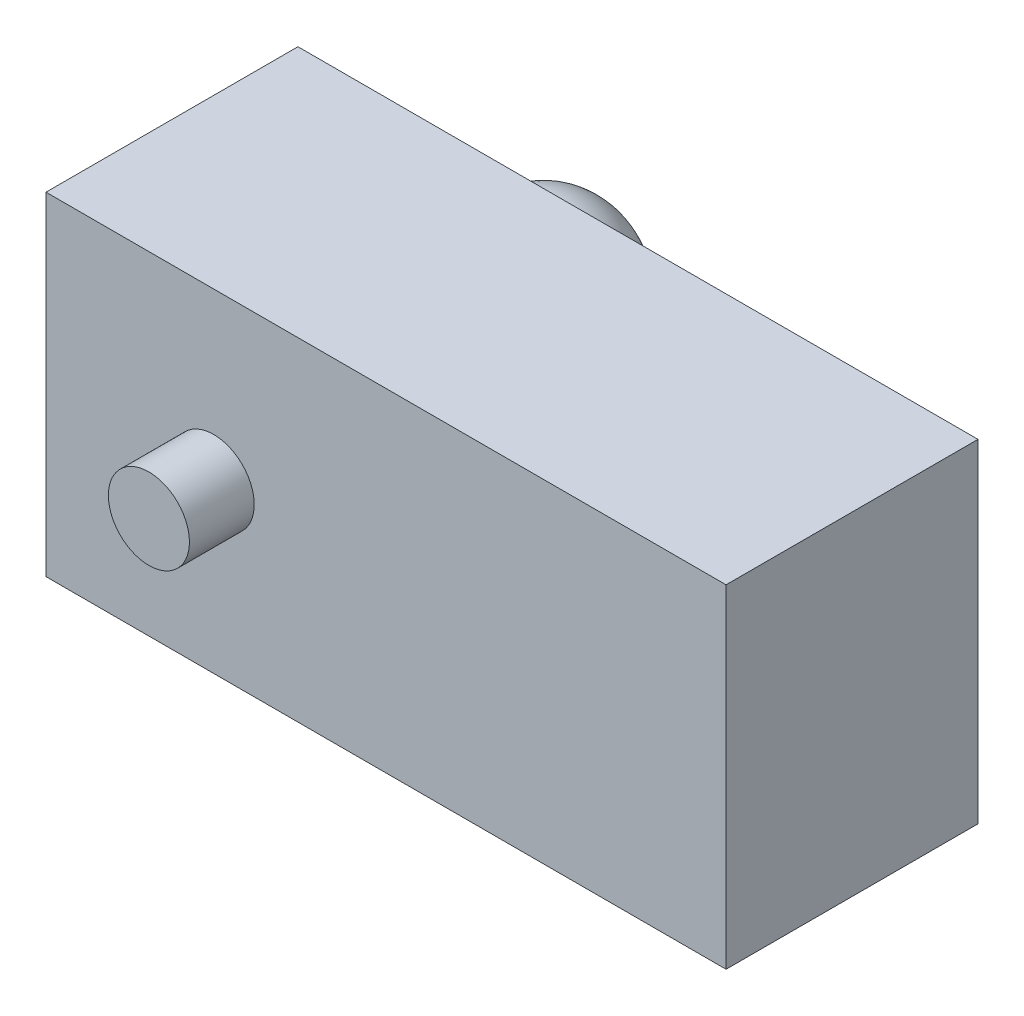
ISO-10303-21;
HEADER;
FILE_DESCRIPTION(('STEP AP214'),'2;1');
FILE_NAME('part.step','',(''),(''),'','','');
FILE_SCHEMA(('AUTOMOTIVE_DESIGN { 1 0 10303 214 1 1 1 1 }'));
ENDSEC;
DATA;
#1=APPLICATION_CONTEXT('core data for automotive mechanical design processes');
#2=APPLICATION_PROTOCOL_DEFINITION('international standard','automotive_design',2000,#1);
#3=PRODUCT_CONTEXT('',#1,'mechanical');
#4=PRODUCT('Part','Part','',(#3));
#5=PRODUCT_RELATED_PRODUCT_CATEGORY('part','',(#4));
#6=PRODUCT_DEFINITION_FORMATION('','',#4);
#7=PRODUCT_DEFINITION_CONTEXT('part definition',#1,'design');
#8=PRODUCT_DEFINITION('design','',#6,#7);
#9=PRODUCT_DEFINITION_SHAPE('','',#8);
#10=(LENGTH_UNIT() NAMED_UNIT(*) SI_UNIT(.MILLI.,.METRE.));
#11=(NAMED_UNIT(*) PLANE_ANGLE_UNIT() SI_UNIT($,.RADIAN.));
#12=(NAMED_UNIT(*) SI_UNIT($,.STERADIAN.) SOLID_ANGLE_UNIT());
#13=UNCERTAINTY_MEASURE_WITH_UNIT(LENGTH_MEASURE(1.E-05),#10,'distance_accuracy_value','');
#14=(GEOMETRIC_REPRESENTATION_CONTEXT(3) GLOBAL_UNCERTAINTY_ASSIGNED_CONTEXT((#13)) GLOBAL_UNIT_ASSIGNED_CONTEXT((#10,
#11,#12)) REPRESENTATION_CONTEXT('',''));
#15=CARTESIAN_POINT('',(0.,0.,0.));
#16=DIRECTION('',(0.,0.,1.));
#17=DIRECTION('',(1.,0.,0.));
#18=AXIS2_PLACEMENT_3D('',#15,#16,#17);
#19=CARTESIAN_POINT('',(-4.89,0.,-4.3));
#20=DIRECTION('',(0.,0.,-1.));
#21=DIRECTION('',(-1.,0.,0.));
#22=AXIS2_PLACEMENT_3D('',#19,#20,#21);
#23=PLANE('',#22);
#24=CARTESIAN_POINT('',(-4.89,0.,-4.3));
#25=DIRECTION('',(0.,0.,1.));
#26=DIRECTION('',(1.,0.,0.));
#27=AXIS2_PLACEMENT_3D('',#24,#25,#26);
#28=CIRCLE('',#27,0.200000000000001);
#29=CARTESIAN_POINT('',(-4.69,0.,-4.3));
#30=VERTEX_POINT('',#29);
#31=CARTESIAN_POINT('',(-5.09,0.,-4.3));
#32=VERTEX_POINT('',#31);
#33=EDGE_CURVE('E66',#30,#32,#28,.T.);
#34=ORIENTED_EDGE('',*,*,#33,.F.);
#35=CARTESIAN_POINT('',(-4.89,0.,-4.3));
#36=DIRECTION('',(0.,0.,1.));
#37=DIRECTION('',(-1.,0.,0.));
#38=AXIS2_PLACEMENT_3D('',#35,#36,#37);
#39=CIRCLE('',#38,0.199999999999999);
#40=EDGE_CURVE('E62',#32,#30,#39,.T.);
#41=ORIENTED_EDGE('',*,*,#40,.F.);
#42=EDGE_LOOP('',(#34,#41));
#43=FACE_BOUND('',#42,.T.);
#44=ADVANCED_FACE('F16',(#43),#23,.T.);
#45=CARTESIAN_POINT('',(-5.09,0.,-2.3));
#46=DIRECTION('',(0.,1.,0.));
#47=DIRECTION('',(-1.,0.,0.));
#48=AXIS2_PLACEMENT_3D('',#45,#46,#47);
#49=CIRCLE('',#48,2.);
#50=TRIMMED_CURVE('',#49,(PARAMETER_VALUE(-1.67096374795646)),
(PARAMETER_VALUE(1.67096374795646)),.T.,.PARAMETER.);
#51=CARTESIAN_POINT('',(-4.89,0.,-2.3));
#52=DIRECTION('',(0.,0.,-1.));
#53=AXIS1_PLACEMENT('',#51,#52);
#54=SURFACE_OF_REVOLUTION('',#50,#53);
#55=ORIENTED_EDGE('',*,*,#40,.T.);
#56=ORIENTED_EDGE('',*,*,#33,.T.);
#57=EDGE_LOOP('',(#55,#56));
#58=FACE_BOUND('',#57,.T.);
#59=CARTESIAN_POINT('',(-4.89,0.,-2.3));
#60=DIRECTION('',(0.,0.,1.));
#61=DIRECTION('',(1.,0.,0.));
#62=AXIS2_PLACEMENT_3D('',#59,#60,#61);
#63=CIRCLE('',#62,2.2);
#64=CARTESIAN_POINT('',(-2.69,0.,-2.3));
#65=VERTEX_POINT('',#64);
#66=EDGE_CURVE('E73',#65,#65,#63,.T.);
#67=ORIENTED_EDGE('',*,*,#66,.F.);
#68=EDGE_LOOP('',(#67));
#69=FACE_BOUND('',#68,.T.);
#70=ADVANCED_FACE('F71',(#58,#69),#54,.F.);
#71=CARTESIAN_POINT('',(-4.89,0.,-4.3));
#72=DIRECTION('',(0.,0.,1.));
#73=DIRECTION('',(1.,0.,0.));
#74=AXIS2_PLACEMENT_3D('',#71,#72,#73);
#75=CYLINDRICAL_SURFACE('',#74,2.2);
#76=CARTESIAN_POINT('',(-4.89,0.,-0.8));
#77=DIRECTION('',(0.,0.,1.));
#78=DIRECTION('',(1.,0.,0.));
#79=AXIS2_PLACEMENT_3D('',#76,#77,#78);
#80=CIRCLE('',#79,2.2);
#81=CARTESIAN_POINT('',(-2.69,0.,-0.8));
#82=VERTEX_POINT('',#81);
#83=EDGE_CURVE('E105',#82,#82,#80,.T.);
#84=ORIENTED_EDGE('',*,*,#83,.F.);
#85=EDGE_LOOP('',(#84));
#86=FACE_BOUND('',#85,.T.);
#87=ORIENTED_EDGE('',*,*,#66,.T.);
#88=EDGE_LOOP('',(#87));
#89=FACE_BOUND('',#88,.T.);
#90=ADVANCED_FACE('F91',(#86,#89),#75,.T.);
#91=CARTESIAN_POINT('',(-4.89,0.,-0.8));
#92=DIRECTION('',(0.,0.,-1.));
#93=DIRECTION('',(-1.,0.,0.));
#94=AXIS2_PLACEMENT_3D('',#91,#92,#93);
#95=PLANE('',#94);
#96=CARTESIAN_POINT('',(-4.89,0.,-0.8));
#97=DIRECTION('',(0.,0.,1.));
#98=DIRECTION('',(1.,0.,0.));
#99=AXIS2_PLACEMENT_3D('',#96,#97,#98);
#100=CIRCLE('',#99,3.65);
#101=CARTESIAN_POINT('',(-1.24,0.,-0.8));
#102=VERTEX_POINT('',#101);
#103=EDGE_CURVE('E277',#102,#102,#100,.T.);
#104=ORIENTED_EDGE('',*,*,#103,.F.);
#105=EDGE_LOOP('',(#104));
#106=FACE_BOUND('',#105,.T.);
#107=ORIENTED_EDGE('',*,*,#83,.T.);
#108=EDGE_LOOP('',(#107));
#109=FACE_BOUND('',#108,.T.);
#110=ADVANCED_FACE('F231',(#106,#109),#95,.T.);
#111=CARTESIAN_POINT('',(-4.89,0.,-0.8));
#112=DIRECTION('',(0.,0.,1.));
#113=DIRECTION('',(1.,0.,0.));
#114=AXIS2_PLACEMENT_3D('',#111,#112,#113);
#115=CYLINDRICAL_SURFACE('',#114,3.65);
#116=ORIENTED_EDGE('',*,*,#103,.T.);
#117=EDGE_LOOP('',(#116));
#118=FACE_BOUND('',#117,.T.);
#119=CARTESIAN_POINT('',(-4.89,0.,0.));
#120=DIRECTION('',(0.,0.,1.));
#121=DIRECTION('',(1.,0.,0.));
#122=AXIS2_PLACEMENT_3D('',#119,#120,#121);
#123=CIRCLE('',#122,3.65);
#124=CARTESIAN_POINT('',(-1.24,0.,0.));
#125=VERTEX_POINT('',#124);
#126=EDGE_CURVE('E280',#125,#125,#123,.F.);
#127=ORIENTED_EDGE('',*,*,#126,.T.);
#128=EDGE_LOOP('',(#127));
#129=FACE_BOUND('',#128,.T.);
#130=ADVANCED_FACE('F222',(#118,#129),#115,.T.);
#131=CARTESIAN_POINT('',(-4.89,0.,8.99));
#132=DIRECTION('',(0.,0.,1.));
#133=DIRECTION('',(1.,0.,0.));
#134=AXIS2_PLACEMENT_3D('',#131,#132,#133);
#135=PLANE('',#134);
#136=CARTESIAN_POINT('',(-4.89,0.,8.99));
#137=DIRECTION('',(0.,0.,-1.));
#138=DIRECTION('',(-1.,0.,0.));
#139=AXIS2_PLACEMENT_3D('',#136,#137,#138);
#140=CIRCLE('',#139,1.15);
#141=CARTESIAN_POINT('',(-6.04,0.,8.99));
#142=VERTEX_POINT('',#141);
#143=EDGE_CURVE('E109',#142,#142,#140,.T.);
#144=ORIENTED_EDGE('',*,*,#143,.F.);
#145=EDGE_LOOP('',(#144));
#146=FACE_BOUND('',#145,.T.);
#147=ADVANCED_FACE('F214',(#146),#135,.T.);
#148=CARTESIAN_POINT('',(0.,0.,0.));
#149=DIRECTION('',(0.,0.,1.));
#150=DIRECTION('',(1.,0.,0.));
#151=AXIS2_PLACEMENT_3D('',#148,#149,#150);
#152=PLANE('',#151);
#153=DIRECTION('',(1.,0.,0.));
#154=VECTOR('',#153,1.);
#155=CARTESIAN_POINT('',(-9.65,-4.725,0.));
#156=LINE('',#155,#154);
#157=CARTESIAN_POINT('',(9.65,-4.725,0.));
#158=VERTEX_POINT('',#157);
#159=CARTESIAN_POINT('',(-9.65,-4.725,0.));
#160=VERTEX_POINT('',#159);
#161=EDGE_CURVE('E123',#158,#160,#156,.F.);
#162=ORIENTED_EDGE('',*,*,#161,.T.);
#163=DIRECTION('',(0.,1.,0.));
#164=VECTOR('',#163,1.);
#165=CARTESIAN_POINT('',(-9.65,4.725,0.));
#166=LINE('',#165,#164);
#167=CARTESIAN_POINT('',(-9.65,4.725,0.));
#168=VERTEX_POINT('',#167);
#169=EDGE_CURVE('E116',#160,#168,#166,.T.);
#170=ORIENTED_EDGE('',*,*,#169,.T.);
#171=DIRECTION('',(1.,0.,0.));
#172=VECTOR('',#171,1.);
#173=CARTESIAN_POINT('',(-9.65,4.725,0.));
#174=LINE('',#173,#172);
#175=CARTESIAN_POINT('',(9.65,4.725,0.));
#176=VERTEX_POINT('',#175);
#177=EDGE_CURVE('E111',#168,#176,#174,.T.);
#178=ORIENTED_EDGE('',*,*,#177,.T.);
#179=DIRECTION('',(0.,1.,0.));
#180=VECTOR('',#179,1.);
#181=CARTESIAN_POINT('',(9.65,4.725,0.));
#182=LINE('',#181,#180);
#183=EDGE_CURVE('E106',#176,#158,#182,.F.);
#184=ORIENTED_EDGE('',*,*,#183,.T.);
#185=EDGE_LOOP('',(#162,#170,#178,#184));
#186=FACE_BOUND('',#185,.T.);
#187=ORIENTED_EDGE('',*,*,#126,.F.);
#188=EDGE_LOOP('',(#187));
#189=FACE_BOUND('',#188,.T.);
#190=ADVANCED_FACE('F143',(#186,#189),#152,.F.);
#191=CARTESIAN_POINT('',(-4.89,0.,8.99));
#192=DIRECTION('',(0.,0.,-1.));
#193=DIRECTION('',(-1.,0.,0.));
#194=AXIS2_PLACEMENT_3D('',#191,#192,#193);
#195=CYLINDRICAL_SURFACE('',#194,1.15);
#196=CARTESIAN_POINT('',(-4.89,0.,7.15));
#197=DIRECTION('',(0.,0.,-1.));
#198=DIRECTION('',(-1.,0.,0.));
#199=AXIS2_PLACEMENT_3D('',#196,#197,#198);
#200=CIRCLE('',#199,1.15);
#201=CARTESIAN_POINT('',(-6.04,0.,7.15));
#202=VERTEX_POINT('',#201);
#203=EDGE_CURVE('E80',#202,#202,#200,.T.);
#204=ORIENTED_EDGE('',*,*,#203,.F.);
#205=EDGE_LOOP('',(#204));
#206=FACE_BOUND('',#205,.T.);
#207=ORIENTED_EDGE('',*,*,#143,.T.);
#208=EDGE_LOOP('',(#207));
#209=FACE_BOUND('',#208,.T.);
#210=ADVANCED_FACE('F152',(#206,#209),#195,.T.);
#211=CARTESIAN_POINT('',(9.65,4.725,7.15));
#212=DIRECTION('',(-1.,0.,0.));
#213=DIRECTION('',(0.,0.,1.));
#214=AXIS2_PLACEMENT_3D('',#211,#212,#213);
#215=PLANE('',#214);
#216=DIRECTION('',(0.,0.,1.));
#217=VECTOR('',#216,1.);
#218=CARTESIAN_POINT('',(9.65,4.725,7.15));
#219=LINE('',#218,#217);
#220=CARTESIAN_POINT('',(9.65,4.725,7.15));
#221=VERTEX_POINT('',#220);
#222=EDGE_CURVE('E108',#176,#221,#219,.T.);
#223=ORIENTED_EDGE('',*,*,#222,.T.);
#224=DIRECTION('',(0.,1.,0.));
#225=VECTOR('',#224,1.);
#226=CARTESIAN_POINT('',(9.65,0.,7.15));
#227=LINE('',#226,#225);
#228=CARTESIAN_POINT('',(9.65,-4.725,7.15));
#229=VERTEX_POINT('',#228);
#230=EDGE_CURVE('E126',#229,#221,#227,.T.);
#231=ORIENTED_EDGE('',*,*,#230,.F.);
#232=DIRECTION('',(0.,0.,1.));
#233=VECTOR('',#232,1.);
#234=CARTESIAN_POINT('',(9.65,-4.725,7.15));
#235=LINE('',#234,#233);
#236=EDGE_CURVE('E120',#229,#158,#235,.F.);
#237=ORIENTED_EDGE('',*,*,#236,.T.);
#238=ORIENTED_EDGE('',*,*,#183,.F.);
#239=EDGE_LOOP('',(#223,#231,#237,#238));
#240=FACE_BOUND('',#239,.T.);
#241=ADVANCED_FACE('F150',(#240),#215,.F.);
#242=CARTESIAN_POINT('',(-9.65,4.725,7.15));
#243=DIRECTION('',(0.,-1.,0.));
#244=DIRECTION('',(1.,0.,0.));
#245=AXIS2_PLACEMENT_3D('',#242,#243,#244);
#246=PLANE('',#245);
#247=DIRECTION('',(0.,0.,1.));
#248=VECTOR('',#247,1.);
#249=CARTESIAN_POINT('',(-9.65,4.725,7.15));
#250=LINE('',#249,#248);
#251=CARTESIAN_POINT('',(-9.65,4.725,7.15));
#252=VERTEX_POINT('',#251);
#253=EDGE_CURVE('E114',#168,#252,#250,.T.);
#254=ORIENTED_EDGE('',*,*,#253,.T.);
#255=DIRECTION('',(1.,0.,0.));
#256=VECTOR('',#255,1.);
#257=CARTESIAN_POINT('',(0.,4.725,7.15));
#258=LINE('',#257,#256);
#259=EDGE_CURVE('E129',#221,#252,#258,.F.);
#260=ORIENTED_EDGE('',*,*,#259,.F.);
#261=ORIENTED_EDGE('',*,*,#222,.F.);
#262=ORIENTED_EDGE('',*,*,#177,.F.);
#263=EDGE_LOOP('',(#254,#260,#261,#262));
#264=FACE_BOUND('',#263,.T.);
#265=ADVANCED_FACE('F140',(#264),#246,.F.);
#266=CARTESIAN_POINT('',(-9.65,4.725,7.15));
#267=DIRECTION('',(1.,0.,0.));
#268=DIRECTION('',(0.,1.,0.));
#269=AXIS2_PLACEMENT_3D('',#266,#267,#268);
#270=PLANE('',#269);
#271=DIRECTION('',(0.,0.,1.));
#272=VECTOR('',#271,1.);
#273=CARTESIAN_POINT('',(-9.65,-4.725,7.15));
#274=LINE('',#273,#272);
#275=CARTESIAN_POINT('',(-9.65,-4.725,7.15));
#276=VERTEX_POINT('',#275);
#277=EDGE_CURVE('E36',#160,#276,#274,.T.);
#278=ORIENTED_EDGE('',*,*,#277,.T.);
#279=DIRECTION('',(0.,1.,0.));
#280=VECTOR('',#279,1.);
#281=CARTESIAN_POINT('',(-9.65,0.,7.15));
#282=LINE('',#281,#280);
#283=EDGE_CURVE('E27',#252,#276,#282,.F.);
#284=ORIENTED_EDGE('',*,*,#283,.F.);
#285=ORIENTED_EDGE('',*,*,#253,.F.);
#286=ORIENTED_EDGE('',*,*,#169,.F.);
#287=EDGE_LOOP('',(#278,#284,#285,#286));
#288=FACE_BOUND('',#287,.T.);
#289=ADVANCED_FACE('F138',(#288),#270,.F.);
#290=CARTESIAN_POINT('',(-9.65,-4.725,7.15));
#291=DIRECTION('',(0.,1.,0.));
#292=DIRECTION('',(0.,0.,1.));
#293=AXIS2_PLACEMENT_3D('',#290,#291,#292);
#294=PLANE('',#293);
#295=ORIENTED_EDGE('',*,*,#236,.F.);
#296=DIRECTION('',(1.,0.,0.));
#297=VECTOR('',#296,1.);
#298=CARTESIAN_POINT('',(0.,-4.725,7.15));
#299=LINE('',#298,#297);
#300=EDGE_CURVE('E11',#276,#229,#299,.T.);
#301=ORIENTED_EDGE('',*,*,#300,.F.);
#302=ORIENTED_EDGE('',*,*,#277,.F.);
#303=ORIENTED_EDGE('',*,*,#161,.F.);
#304=EDGE_LOOP('',(#295,#301,#302,#303));
#305=FACE_BOUND('',#304,.T.);
#306=ADVANCED_FACE('F148',(#305),#294,.F.);
#307=CARTESIAN_POINT('',(0.,0.,7.15));
#308=DIRECTION('',(0.,0.,1.));
#309=DIRECTION('',(1.,0.,0.));
#310=AXIS2_PLACEMENT_3D('',#307,#308,#309);
#311=PLANE('',#310);
#312=ORIENTED_EDGE('',*,*,#283,.T.);
#313=ORIENTED_EDGE('',*,*,#300,.T.);
#314=ORIENTED_EDGE('',*,*,#230,.T.);
#315=ORIENTED_EDGE('',*,*,#259,.T.);
#316=EDGE_LOOP('',(#312,#313,#314,#315));
#317=FACE_BOUND('',#316,.T.);
#318=ORIENTED_EDGE('',*,*,#203,.T.);
#319=EDGE_LOOP('',(#318));
#320=FACE_BOUND('',#319,.T.);
#321=ADVANCED_FACE('F134',(#317,#320),#311,.T.);
#322=CLOSED_SHELL('',(#44,#70,#90,#110,#130,#147,#190,#210,#241,#265,#289,#306,#321));
#323=MANIFOLD_SOLID_BREP('B1',#322);
#324=ADVANCED_BREP_SHAPE_REPRESENTATION('',(#18,#323),#14);
#325=SHAPE_DEFINITION_REPRESENTATION(#9,#324);
ENDSEC;
END-ISO-10303-21;
